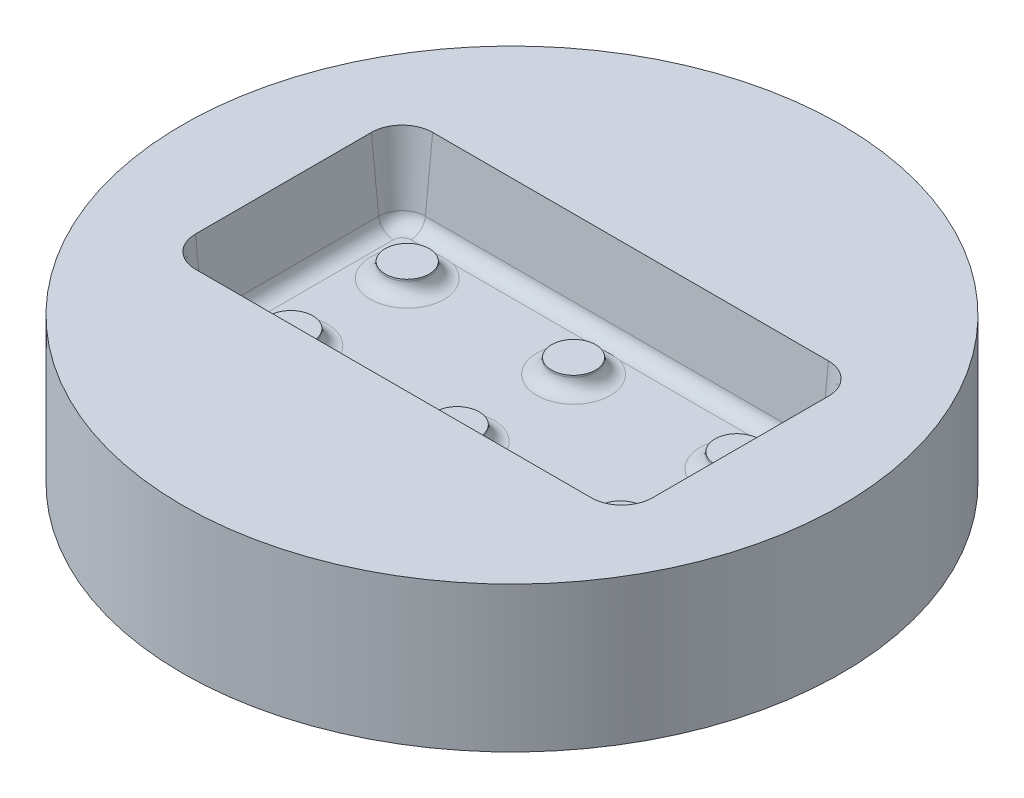
ISO-10303-21;
HEADER;
FILE_DESCRIPTION(('STEP AP214'),'2;1');
FILE_NAME('part.step','',(''),(''),'','','');
FILE_SCHEMA(('AUTOMOTIVE_DESIGN { 1 0 10303 214 1 1 1 1 }'));
ENDSEC;
DATA;
#1=APPLICATION_CONTEXT('core data for automotive mechanical design processes');
#2=APPLICATION_PROTOCOL_DEFINITION('international standard','automotive_design',2000,#1);
#3=PRODUCT_CONTEXT('',#1,'mechanical');
#4=PRODUCT('Part','Part','',(#3));
#5=PRODUCT_RELATED_PRODUCT_CATEGORY('part','',(#4));
#6=PRODUCT_DEFINITION_FORMATION('','',#4);
#7=PRODUCT_DEFINITION_CONTEXT('part definition',#1,'design');
#8=PRODUCT_DEFINITION('design','',#6,#7);
#9=PRODUCT_DEFINITION_SHAPE('','',#8);
#10=(LENGTH_UNIT() NAMED_UNIT(*) SI_UNIT(.MILLI.,.METRE.));
#11=(NAMED_UNIT(*) PLANE_ANGLE_UNIT() SI_UNIT($,.RADIAN.));
#12=(NAMED_UNIT(*) SI_UNIT($,.STERADIAN.) SOLID_ANGLE_UNIT());
#13=UNCERTAINTY_MEASURE_WITH_UNIT(LENGTH_MEASURE(1.E-05),#10,'distance_accuracy_value','');
#14=(GEOMETRIC_REPRESENTATION_CONTEXT(3) GLOBAL_UNCERTAINTY_ASSIGNED_CONTEXT((#13)) GLOBAL_UNIT_ASSIGNED_CONTEXT((#10,
#11,#12)) REPRESENTATION_CONTEXT('',''));
#15=CARTESIAN_POINT('',(0.,0.,0.));
#16=DIRECTION('',(0.,0.,1.));
#17=DIRECTION('',(1.,0.,0.));
#18=AXIS2_PLACEMENT_3D('',#15,#16,#17);
#19=CARTESIAN_POINT('',(0.,-21.9479999999999,0.));
#20=DIRECTION('',(0.,1.,0.));
#21=DIRECTION('',(0.,0.,1.));
#22=AXIS2_PLACEMENT_3D('',#19,#20,#21);
#23=CYLINDRICAL_SURFACE('',#22,114.217109759445);
#24=CARTESIAN_POINT('',(0.,28.448,0.));
#25=DIRECTION('',(0.,-1.,0.));
#26=DIRECTION('',(0.,0.,-1.));
#27=AXIS2_PLACEMENT_3D('',#24,#25,#26);
#28=CIRCLE('',#27,114.217109759445);
#29=CARTESIAN_POINT('',(0.,28.448,-114.217109759445));
#30=VERTEX_POINT('',#29);
#31=EDGE_CURVE('E44',#30,#30,#28,.F.);
#32=ORIENTED_EDGE('',*,*,#31,.F.);
#33=EDGE_LOOP('',(#32));
#34=FACE_BOUND('',#33,.T.);
#35=CARTESIAN_POINT('',(0.,-21.9479999999999,0.));
#36=DIRECTION('',(0.,1.,0.));
#37=DIRECTION('',(0.,0.,1.));
#38=AXIS2_PLACEMENT_3D('',#35,#36,#37);
#39=CIRCLE('',#38,114.217109759445);
#40=CARTESIAN_POINT('',(0.,-21.9479999999999,114.217109759445));
#41=VERTEX_POINT('',#40);
#42=EDGE_CURVE('E197',#41,#41,#39,.T.);
#43=ORIENTED_EDGE('',*,*,#42,.T.);
#44=EDGE_LOOP('',(#43));
#45=FACE_BOUND('',#44,.T.);
#46=ADVANCED_FACE('F41',(#34,#45),#23,.T.);
#47=CARTESIAN_POINT('',(0.,-21.9479999999999,0.));
#48=DIRECTION('',(0.,1.,0.));
#49=DIRECTION('',(0.,0.,1.));
#50=AXIS2_PLACEMENT_3D('',#47,#48,#49);
#51=PLANE('',#50);
#52=ORIENTED_EDGE('',*,*,#42,.F.);
#53=EDGE_LOOP('',(#52));
#54=FACE_BOUND('',#53,.T.);
#55=ADVANCED_FACE('F400',(#54),#51,.F.);
#56=CARTESIAN_POINT('',(56.6116733544156,0.,-21.3549155204973));
#57=DIRECTION('',(0.,-1.,0.));
#58=DIRECTION('',(0.,0.,1.));
#59=AXIS2_PLACEMENT_3D('',#56,#57,#58);
#60=CONICAL_SURFACE('',#59,8.16632827016466,0.10471975511966);
#61=CARTESIAN_POINT('',(56.6116733544156,4.54899540660032,-21.3549155204973));
#62=DIRECTION('',(0.,-1.,0.));
#63=DIRECTION('',(0.,0.,-1.));
#64=AXIS2_PLACEMENT_3D('',#61,#62,#63);
#65=CIRCLE('',#64,7.68820958672686);
#66=CARTESIAN_POINT('',(56.6116733544156,4.54899540660032,-29.0431251072241));
#67=VERTEX_POINT('',#66);
#68=EDGE_CURVE('E202',#67,#67,#65,.T.);
#69=ORIENTED_EDGE('',*,*,#68,.F.);
#70=EDGE_LOOP('',(#69));
#71=FACE_BOUND('',#70,.T.);
#72=CARTESIAN_POINT('',(56.6116733544156,5.08,-21.3549155204973));
#73=DIRECTION('',(0.,1.,0.));
#74=DIRECTION('',(0.,0.,1.));
#75=AXIS2_PLACEMENT_3D('',#72,#73,#74);
#76=CIRCLE('',#75,7.63239875501502);
#77=CARTESIAN_POINT('',(56.6116733544156,5.08,-13.7225167654822));
#78=VERTEX_POINT('',#77);
#79=EDGE_CURVE('E206',#78,#78,#76,.T.);
#80=ORIENTED_EDGE('',*,*,#79,.F.);
#81=EDGE_LOOP('',(#80));
#82=FACE_BOUND('',#81,.T.);
#83=ADVANCED_FACE('F402',(#71,#82),#60,.T.);
#84=CARTESIAN_POINT('',(56.6116733544156,5.08,-21.3549155204973));
#85=DIRECTION('',(0.,-1.,0.));
#86=DIRECTION('',(0.,0.,-1.));
#87=AXIS2_PLACEMENT_3D('',#84,#85,#86);
#88=TOROIDAL_SURFACE('',#87,12.7403808151977,5.08);
#89=ORIENTED_EDGE('',*,*,#68,.T.);
#90=EDGE_LOOP('',(#89));
#91=FACE_BOUND('',#90,.T.);
#92=CARTESIAN_POINT('',(56.6116733544156,0.,-21.3549155204973));
#93=DIRECTION('',(0.,-1.,0.));
#94=DIRECTION('',(0.,0.,-1.));
#95=AXIS2_PLACEMENT_3D('',#92,#93,#94);
#96=CIRCLE('',#95,12.7403808151977);
#97=CARTESIAN_POINT('',(52.845603125865,0.,-33.525947454967));
#98=VERTEX_POINT('',#97);
#99=CARTESIAN_POINT('',(60.3777435829662,0.,-33.525947454967));
#100=VERTEX_POINT('',#99);
#101=EDGE_CURVE('E212',#98,#100,#96,.F.);
#102=ORIENTED_EDGE('',*,*,#101,.T.);
#103=CARTESIAN_POINT('',(60.3777435829662,0.,-33.525947454967));
#104=CARTESIAN_POINT('',(60.3691022754913,7.0221097237528E-09,-33.527253837442));
#105=CARTESIAN_POINT('',(60.3604602795215,5.10568351017943E-07,-33.5285558251084));
#106=CARTESIAN_POINT('',(60.042574509333,3.69626226219725E-05,-33.5762824023694));
#107=CARTESIAN_POINT('',(59.7324565088365,0.00069657338444418,-33.6170815987803));
#108=CARTESIAN_POINT('',(59.1108963569137,0.00243856469882936,-33.6871943275211));
#109=CARTESIAN_POINT('',(58.7994540271289,0.00352100410377502,-33.7165062598314));
#110=CARTESIAN_POINT('',(58.1755037678462,0.00550228255029649,-33.7634911686048));
#111=CARTESIAN_POINT('',(57.8629953224937,0.00640101406231198,-33.7811573418499));
#112=CARTESIAN_POINT('',(57.2375490222082,0.00764116173391657,-33.8047224272097));
#113=CARTESIAN_POINT('',(56.9246111882643,0.00798260422675366,-33.8106218953324));
#114=CARTESIAN_POINT('',(56.2987355203926,0.00798260422664008,-33.8106218953277));
#115=CARTESIAN_POINT('',(55.9857976864647,0.00764116173372302,-33.8047224272009));
#116=CARTESIAN_POINT('',(55.3603513862067,0.00640101406193249,-33.7811573418478));
#117=CARTESIAN_POINT('',(55.0478429408655,0.00550228254980694,-33.7634911686133));
#118=CARTESIAN_POINT('',(54.4238926816168,0.00352100410361389,-33.7165062598074));
#119=CARTESIAN_POINT('',(54.1124503518545,0.00243856469910808,-33.6871943274541));
#120=CARTESIAN_POINT('',(53.4908901999503,0.00069657338386361,-33.6170815988352));
#121=CARTESIAN_POINT('',(53.18077219945,3.69626207363039E-05,-33.5762824025893));
#122=CARTESIAN_POINT('',(52.8628864293115,5.10568246455193E-07,-33.5285558251212));
#123=CARTESIAN_POINT('',(52.8542444333409,7.02205596172312E-09,-33.5272538374486));
#124=CARTESIAN_POINT('',(52.845603125865,0.,-33.525947454967));
#125=B_SPLINE_CURVE_WITH_KNOTS('',3,(#103,#104,#105,#106,#107,#108,#109,#110,#111,#112,#113,
#114,#115,#116,#117,#118,#119,#120,#121,#122,#123,#124),.UNSPECIFIED.,.F.,.F.,(4,2,2,2,2,2,2,2,
2,2,4),(0.,0.0262185642852851,0.964343135646278,1.90259832859866,2.84140114677195,
3.7801596029672,4.71891805911625,5.65772087725022,6.59597607015474,7.53410064145413,
7.560319205745),.UNSPECIFIED.);
#126=EDGE_CURVE('E956',#100,#98,#125,.T.);
#127=ORIENTED_EDGE('',*,*,#126,.T.);
#128=EDGE_LOOP('',(#102,#127));
#129=FACE_BOUND('',#128,.T.);
#130=ADVANCED_FACE('F408',(#91,#129),#88,.F.);
#131=CARTESIAN_POINT('',(0.,0.,-21.3549155204973));
#132=DIRECTION('',(0.,-1.,0.));
#133=DIRECTION('',(0.,0.,1.));
#134=AXIS2_PLACEMENT_3D('',#131,#132,#133);
#135=CONICAL_SURFACE('',#134,8.16632827016466,0.10471975511966);
#136=CARTESIAN_POINT('',(0.,4.54899540660032,-21.3549155204973));
#137=DIRECTION('',(0.,-1.,0.));
#138=DIRECTION('',(0.,0.,-1.));
#139=AXIS2_PLACEMENT_3D('',#136,#137,#138);
#140=CIRCLE('',#139,7.68820958672685);
#141=CARTESIAN_POINT('',(0.,4.54899540660032,-29.0431251072241));
#142=VERTEX_POINT('',#141);
#143=EDGE_CURVE('E908',#142,#142,#140,.T.);
#144=ORIENTED_EDGE('',*,*,#143,.F.);
#145=EDGE_LOOP('',(#144));
#146=FACE_BOUND('',#145,.T.);
#147=CARTESIAN_POINT('',(0.,5.08,-21.3549155204973));
#148=DIRECTION('',(0.,1.,0.));
#149=DIRECTION('',(0.,0.,1.));
#150=AXIS2_PLACEMENT_3D('',#147,#148,#149);
#151=CIRCLE('',#150,7.63239875501502);
#152=CARTESIAN_POINT('',(0.,5.08,-13.7225167654822));
#153=VERTEX_POINT('',#152);
#154=EDGE_CURVE('E215',#153,#153,#151,.T.);
#155=ORIENTED_EDGE('',*,*,#154,.F.);
#156=EDGE_LOOP('',(#155));
#157=FACE_BOUND('',#156,.T.);
#158=ADVANCED_FACE('F354',(#146,#157),#135,.T.);
#159=CARTESIAN_POINT('',(0.,5.08,-21.3549155204973));
#160=DIRECTION('',(0.,-1.,0.));
#161=DIRECTION('',(0.,0.,-1.));
#162=AXIS2_PLACEMENT_3D('',#159,#160,#161);
#163=TOROIDAL_SURFACE('',#162,12.7403808151977,5.08);
#164=ORIENTED_EDGE('',*,*,#143,.T.);
#165=EDGE_LOOP('',(#164));
#166=FACE_BOUND('',#165,.T.);
#167=CARTESIAN_POINT('',(0.,0.,-21.3549155204973));
#168=DIRECTION('',(0.,-1.,0.));
#169=DIRECTION('',(0.,0.,-1.));
#170=AXIS2_PLACEMENT_3D('',#167,#168,#169);
#171=CIRCLE('',#170,12.7403808151977);
#172=CARTESIAN_POINT('',(-3.76607022855059,0.,-33.525947454967));
#173=VERTEX_POINT('',#172);
#174=CARTESIAN_POINT('',(3.76607022855059,0.,-33.525947454967));
#175=VERTEX_POINT('',#174);
#176=EDGE_CURVE('E367',#173,#175,#171,.F.);
#177=ORIENTED_EDGE('',*,*,#176,.T.);
#178=CARTESIAN_POINT('',(3.76607022855059,0.,-33.525947454967));
#179=CARTESIAN_POINT('',(3.75742892107565,7.02210952792845E-09,-33.527253837442));
#180=CARTESIAN_POINT('',(3.74878692510592,5.10568350820868E-07,-33.5285558251084));
#181=CARTESIAN_POINT('',(3.43090115491744,3.69626226217036E-05,-33.5762824023694));
#182=CARTESIAN_POINT('',(3.12078315442102,0.000696573384442937,-33.6170815987803));
#183=CARTESIAN_POINT('',(2.49922300249838,0.00243856469882717,-33.6871943275211));
#184=CARTESIAN_POINT('',(2.18778067271368,0.00352100410377285,-33.7165062598313));
#185=CARTESIAN_POINT('',(1.56383041343132,0.00550228255029443,-33.7634911686048));
#186=CARTESIAN_POINT('',(1.25132196807897,0.00640101406231007,-33.7811573418499));
#187=CARTESIAN_POINT('',(0.625875667793867,0.00764116173391521,-33.8047224272096));
#188=CARTESIAN_POINT('',(0.312937833850147,0.00798260422675264,-33.8106218953323));
#189=CARTESIAN_POINT('',(-0.312937834021525,0.00798260422664139,-33.8106218953277));
#190=CARTESIAN_POINT('',(-0.625875667949476,0.00764116173372574,-33.804722427201));
#191=CARTESIAN_POINT('',(-1.25132196820761,0.0064010140619356,-33.7811573418478));
#192=CARTESIAN_POINT('',(-1.56383041354875,0.00550228254980916,-33.7634911686131));
#193=CARTESIAN_POINT('',(-2.18778067279778,0.00352100410361825,-33.7165062598077));
#194=CARTESIAN_POINT('',(-2.49922300256037,0.00243856469911538,-33.6871943274553));
#195=CARTESIAN_POINT('',(-3.12078315446465,0.000696573383861434,-33.6170815988343));
#196=CARTESIAN_POINT('',(-3.43090115496486,3.69626207218398E-05,-33.5762824025855));
#197=CARTESIAN_POINT('',(-3.74878692510411,5.1056824627784E-07,-33.528555825121));
#198=CARTESIAN_POINT('',(-3.75742892107476,7.02205619320555E-09,-33.5272538374485));
#199=CARTESIAN_POINT('',(-3.76607022855059,0.,-33.525947454967));
#200=B_SPLINE_CURVE_WITH_KNOTS('',3,(#178,#179,#180,#181,#182,#183,#184,#185,#186,#187,#188,
#189,#190,#191,#192,#193,#194,#195,#196,#197,#198,#199),.UNSPECIFIED.,.F.,.F.,(4,2,2,2,2,2,2,2,
2,2,4),(0.,0.0262185642852881,0.964343135646034,1.90259832859816,2.84140114677082,
3.78015960296557,4.7189180591149,5.65772087724894,6.59597607015401,7.5341006414542,
7.56031920574499),.UNSPECIFIED.);
#201=EDGE_CURVE('E358',#175,#173,#200,.T.);
#202=ORIENTED_EDGE('',*,*,#201,.T.);
#203=EDGE_LOOP('',(#177,#202));
#204=FACE_BOUND('',#203,.T.);
#205=ADVANCED_FACE('F349',(#166,#204),#163,.F.);
#206=CARTESIAN_POINT('',(0.,0.,18.9850819011923));
#207=DIRECTION('',(0.,-1.,0.));
#208=DIRECTION('',(0.,0.,1.));
#209=AXIS2_PLACEMENT_3D('',#206,#207,#208);
#210=CONICAL_SURFACE('',#209,8.16632827016466,0.10471975511966);
#211=CARTESIAN_POINT('',(0.,4.54899540660032,18.9850819011923));
#212=DIRECTION('',(0.,-1.,0.));
#213=DIRECTION('',(0.,0.,-1.));
#214=AXIS2_PLACEMENT_3D('',#211,#212,#213);
#215=CIRCLE('',#214,7.68820958672685);
#216=CARTESIAN_POINT('',(0.,4.54899540660032,11.2968723144655));
#217=VERTEX_POINT('',#216);
#218=EDGE_CURVE('E366',#217,#217,#215,.T.);
#219=ORIENTED_EDGE('',*,*,#218,.F.);
#220=EDGE_LOOP('',(#219));
#221=FACE_BOUND('',#220,.T.);
#222=CARTESIAN_POINT('',(0.,5.08,18.9850819011923));
#223=DIRECTION('',(0.,1.,0.));
#224=DIRECTION('',(0.,0.,1.));
#225=AXIS2_PLACEMENT_3D('',#222,#223,#224);
#226=CIRCLE('',#225,7.63239875501502);
#227=CARTESIAN_POINT('',(0.,5.08,26.6174806562073));
#228=VERTEX_POINT('',#227);
#229=EDGE_CURVE('E912',#228,#228,#226,.T.);
#230=ORIENTED_EDGE('',*,*,#229,.F.);
#231=EDGE_LOOP('',(#230));
#232=FACE_BOUND('',#231,.T.);
#233=ADVANCED_FACE('F345',(#221,#232),#210,.T.);
#234=CARTESIAN_POINT('',(0.,5.08,18.9850819011923));
#235=DIRECTION('',(0.,-1.,0.));
#236=DIRECTION('',(0.,0.,-1.));
#237=AXIS2_PLACEMENT_3D('',#234,#235,#236);
#238=TOROIDAL_SURFACE('',#237,12.7403808151977,5.08);
#239=ORIENTED_EDGE('',*,*,#218,.T.);
#240=EDGE_LOOP('',(#239));
#241=FACE_BOUND('',#240,.T.);
#242=CARTESIAN_POINT('',(0.,0.,18.9850819011923));
#243=DIRECTION('',(0.,-1.,0.));
#244=DIRECTION('',(0.,0.,-1.));
#245=AXIS2_PLACEMENT_3D('',#242,#243,#244);
#246=CIRCLE('',#245,12.7403808151977);
#247=CARTESIAN_POINT('',(0.,0.,6.24470108599464));
#248=VERTEX_POINT('',#247);
#249=EDGE_CURVE('E917',#248,#248,#246,.F.);
#250=ORIENTED_EDGE('',*,*,#249,.T.);
#251=EDGE_LOOP('',(#250));
#252=FACE_BOUND('',#251,.T.);
#253=ADVANCED_FACE('F341',(#241,#252),#238,.F.);
#254=CARTESIAN_POINT('',(56.6116733544156,0.,18.9850819011923));
#255=DIRECTION('',(0.,-1.,0.));
#256=DIRECTION('',(0.,0.,1.));
#257=AXIS2_PLACEMENT_3D('',#254,#255,#256);
#258=CONICAL_SURFACE('',#257,8.16632827016466,0.10471975511966);
#259=CARTESIAN_POINT('',(56.6116733544156,4.54899540660032,18.9850819011923));
#260=DIRECTION('',(0.,-1.,0.));
#261=DIRECTION('',(0.,0.,-1.));
#262=AXIS2_PLACEMENT_3D('',#259,#260,#261);
#263=CIRCLE('',#262,7.68820958672686);
#264=CARTESIAN_POINT('',(56.6116733544156,4.54899540660032,11.2968723144655));
#265=VERTEX_POINT('',#264);
#266=EDGE_CURVE('E928',#265,#265,#263,.T.);
#267=ORIENTED_EDGE('',*,*,#266,.F.);
#268=EDGE_LOOP('',(#267));
#269=FACE_BOUND('',#268,.T.);
#270=CARTESIAN_POINT('',(56.6116733544156,5.08,18.9850819011923));
#271=DIRECTION('',(0.,1.,0.));
#272=DIRECTION('',(0.,0.,1.));
#273=AXIS2_PLACEMENT_3D('',#270,#271,#272);
#274=CIRCLE('',#273,7.63239875501502);
#275=CARTESIAN_POINT('',(56.6116733544156,5.08,26.6174806562073));
#276=VERTEX_POINT('',#275);
#277=EDGE_CURVE('E922',#276,#276,#274,.T.);
#278=ORIENTED_EDGE('',*,*,#277,.F.);
#279=EDGE_LOOP('',(#278));
#280=FACE_BOUND('',#279,.T.);
#281=ADVANCED_FACE('F337',(#269,#280),#258,.T.);
#282=CARTESIAN_POINT('',(56.6116733544156,5.08,18.9850819011923));
#283=DIRECTION('',(0.,-1.,0.));
#284=DIRECTION('',(0.,0.,-1.));
#285=AXIS2_PLACEMENT_3D('',#282,#283,#284);
#286=TOROIDAL_SURFACE('',#285,12.7403808151977,5.08);
#287=ORIENTED_EDGE('',*,*,#266,.T.);
#288=EDGE_LOOP('',(#287));
#289=FACE_BOUND('',#288,.T.);
#290=CARTESIAN_POINT('',(56.6116733544156,0.,18.9850819011923));
#291=DIRECTION('',(0.,-1.,0.));
#292=DIRECTION('',(0.,0.,-1.));
#293=AXIS2_PLACEMENT_3D('',#290,#291,#292);
#294=CIRCLE('',#293,12.7403808151977);
#295=CARTESIAN_POINT('',(56.6116733544156,0.,6.24470108599464));
#296=VERTEX_POINT('',#295);
#297=EDGE_CURVE('E927',#296,#296,#294,.F.);
#298=ORIENTED_EDGE('',*,*,#297,.T.);
#299=EDGE_LOOP('',(#298));
#300=FACE_BOUND('',#299,.T.);
#301=ADVANCED_FACE('F333',(#289,#300),#286,.F.);
#302=CARTESIAN_POINT('',(-57.6575438319214,0.,18.9850819011923));
#303=DIRECTION('',(0.,-1.,0.));
#304=DIRECTION('',(0.,0.,1.));
#305=AXIS2_PLACEMENT_3D('',#302,#303,#304);
#306=CONICAL_SURFACE('',#305,8.16632827016466,0.10471975511966);
#307=CARTESIAN_POINT('',(-57.6575438319214,4.54899540660032,18.9850819011923));
#308=DIRECTION('',(0.,-1.,0.));
#309=DIRECTION('',(0.,0.,-1.));
#310=AXIS2_PLACEMENT_3D('',#307,#308,#309);
#311=CIRCLE('',#310,7.68820958672686);
#312=CARTESIAN_POINT('',(-57.6575438319214,4.54899540660032,11.2968723144655));
#313=VERTEX_POINT('',#312);
#314=EDGE_CURVE('E937',#313,#313,#311,.T.);
#315=ORIENTED_EDGE('',*,*,#314,.F.);
#316=EDGE_LOOP('',(#315));
#317=FACE_BOUND('',#316,.T.);
#318=CARTESIAN_POINT('',(-57.6575438319214,5.08,18.9850819011923));
#319=DIRECTION('',(0.,1.,0.));
#320=DIRECTION('',(0.,0.,1.));
#321=AXIS2_PLACEMENT_3D('',#318,#319,#320);
#322=CIRCLE('',#321,7.63239875501502);
#323=CARTESIAN_POINT('',(-57.6575438319214,5.08,26.6174806562073));
#324=VERTEX_POINT('',#323);
#325=EDGE_CURVE('E933',#324,#324,#322,.T.);
#326=ORIENTED_EDGE('',*,*,#325,.F.);
#327=EDGE_LOOP('',(#326));
#328=FACE_BOUND('',#327,.T.);
#329=ADVANCED_FACE('F329',(#317,#328),#306,.T.);
#330=CARTESIAN_POINT('',(-57.6575438319214,5.08,18.9850819011923));
#331=DIRECTION('',(0.,-1.,0.));
#332=DIRECTION('',(0.,0.,-1.));
#333=AXIS2_PLACEMENT_3D('',#330,#331,#332);
#334=TOROIDAL_SURFACE('',#333,12.7403808151977,5.08);
#335=ORIENTED_EDGE('',*,*,#314,.T.);
#336=EDGE_LOOP('',(#335));
#337=FACE_BOUND('',#336,.T.);
#338=CARTESIAN_POINT('',(-57.6575438319214,0.,18.9850819011923));
#339=DIRECTION('',(0.,-1.,0.));
#340=DIRECTION('',(0.,0.,-1.));
#341=AXIS2_PLACEMENT_3D('',#338,#339,#340);
#342=CIRCLE('',#341,12.7403808151977);
#343=CARTESIAN_POINT('',(-57.6575438319214,0.,6.24470108599464));
#344=VERTEX_POINT('',#343);
#345=EDGE_CURVE('E266',#344,#344,#342,.F.);
#346=ORIENTED_EDGE('',*,*,#345,.T.);
#347=EDGE_LOOP('',(#346));
#348=FACE_BOUND('',#347,.T.);
#349=ADVANCED_FACE('F325',(#337,#348),#334,.F.);
#350=CARTESIAN_POINT('',(68.58,0.,-30.48));
#351=DIRECTION('',(0.,-1.,0.));
#352=DIRECTION('',(0.,0.,-1.));
#353=AXIS2_PLACEMENT_3D('',#350,#351,#352);
#354=PLANE('',#353);
#355=ORIENTED_EDGE('',*,*,#345,.F.);
#356=EDGE_LOOP('',(#355));
#357=FACE_BOUND('',#356,.T.);
#358=ORIENTED_EDGE('',*,*,#297,.F.);
#359=EDGE_LOOP('',(#358));
#360=FACE_BOUND('',#359,.T.);
#361=ORIENTED_EDGE('',*,*,#249,.F.);
#362=EDGE_LOOP('',(#361));
#363=FACE_BOUND('',#362,.T.);
#364=DIRECTION('',(0.,0.,1.));
#365=VECTOR('',#364,1.);
#366=CARTESIAN_POINT('',(71.625947454967,0.,30.4799999999999));
#367=LINE('',#366,#365);
#368=CARTESIAN_POINT('',(71.625947454967,0.,-30.48));
#369=VERTEX_POINT('',#368);
#370=CARTESIAN_POINT('',(71.625947454967,0.,30.48));
#371=VERTEX_POINT('',#370);
#372=EDGE_CURVE('E255',#369,#371,#367,.T.);
#373=ORIENTED_EDGE('',*,*,#372,.F.);
#374=CARTESIAN_POINT('',(68.58,0.,-30.48));
#375=DIRECTION('',(0.,-1.,0.));
#376=DIRECTION('',(0.,0.,-1.));
#377=AXIS2_PLACEMENT_3D('',#374,#375,#376);
#378=CIRCLE('',#377,3.04594745496697);
#379=CARTESIAN_POINT('',(68.5799999999999,0.,-33.525947454967));
#380=VERTEX_POINT('',#379);
#381=EDGE_CURVE('E968',#380,#369,#378,.T.);
#382=ORIENTED_EDGE('',*,*,#381,.F.);
#383=DIRECTION('',(1.,0.,0.));
#384=VECTOR('',#383,1.);
#385=CARTESIAN_POINT('',(68.5799999999999,0.,-33.525947454967));
#386=LINE('',#385,#384);
#387=EDGE_CURVE('E965',#100,#380,#386,.T.);
#388=ORIENTED_EDGE('',*,*,#387,.F.);
#389=ORIENTED_EDGE('',*,*,#101,.F.);
#390=DIRECTION('',(1.,0.,0.));
#391=VECTOR('',#390,1.);
#392=CARTESIAN_POINT('',(68.5799999999999,0.,-33.525947454967));
#393=LINE('',#392,#391);
#394=EDGE_CURVE('E368',#175,#98,#393,.T.);
#395=ORIENTED_EDGE('',*,*,#394,.F.);
#396=ORIENTED_EDGE('',*,*,#176,.F.);
#397=DIRECTION('',(1.,0.,0.));
#398=VECTOR('',#397,1.);
#399=CARTESIAN_POINT('',(68.5799999999999,0.,-33.525947454967));
#400=LINE('',#399,#398);
#401=CARTESIAN_POINT('',(-53.8914736033708,0.,-33.525947454967));
#402=VERTEX_POINT('',#401);
#403=EDGE_CURVE('E370',#402,#173,#400,.T.);
#404=ORIENTED_EDGE('',*,*,#403,.F.);
#405=CARTESIAN_POINT('',(-57.6575438319214,0.,-21.3549155204973));
#406=DIRECTION('',(0.,-1.,0.));
#407=DIRECTION('',(0.,0.,-1.));
#408=AXIS2_PLACEMENT_3D('',#405,#406,#407);
#409=CIRCLE('',#408,12.7403808151977);
#410=CARTESIAN_POINT('',(-61.423614060472,0.,-33.525947454967));
#411=VERTEX_POINT('',#410);
#412=EDGE_CURVE('E976',#411,#402,#409,.F.);
#413=ORIENTED_EDGE('',*,*,#412,.F.);
#414=DIRECTION('',(1.,0.,0.));
#415=VECTOR('',#414,1.);
#416=CARTESIAN_POINT('',(68.5799999999999,0.,-33.525947454967));
#417=LINE('',#416,#415);
#418=CARTESIAN_POINT('',(-68.58,0.,-33.525947454967));
#419=VERTEX_POINT('',#418);
#420=EDGE_CURVE('E297',#419,#411,#417,.T.);
#421=ORIENTED_EDGE('',*,*,#420,.F.);
#422=CARTESIAN_POINT('',(-68.58,0.,-30.48));
#423=DIRECTION('',(0.,-1.,0.));
#424=DIRECTION('',(0.,0.,-1.));
#425=AXIS2_PLACEMENT_3D('',#422,#423,#424);
#426=CIRCLE('',#425,3.04594745496697);
#427=CARTESIAN_POINT('',(-71.625947454967,0.,-30.48));
#428=VERTEX_POINT('',#427);
#429=EDGE_CURVE('E289',#428,#419,#426,.T.);
#430=ORIENTED_EDGE('',*,*,#429,.F.);
#431=DIRECTION('',(0.,0.,-1.));
#432=VECTOR('',#431,1.);
#433=CARTESIAN_POINT('',(-71.625947454967,0.,-30.48));
#434=LINE('',#433,#432);
#435=CARTESIAN_POINT('',(-71.625947454967,0.,30.4799999999999));
#436=VERTEX_POINT('',#435);
#437=EDGE_CURVE('E283',#436,#428,#434,.T.);
#438=ORIENTED_EDGE('',*,*,#437,.F.);
#439=CARTESIAN_POINT('',(-68.58,0.,30.48));
#440=DIRECTION('',(0.,-1.,0.));
#441=DIRECTION('',(0.,0.,-1.));
#442=AXIS2_PLACEMENT_3D('',#439,#440,#441);
#443=CIRCLE('',#442,3.04594745496697);
#444=CARTESIAN_POINT('',(-68.58,0.,33.525947454967));
#445=VERTEX_POINT('',#444);
#446=EDGE_CURVE('E277',#445,#436,#443,.T.);
#447=ORIENTED_EDGE('',*,*,#446,.F.);
#448=DIRECTION('',(-1.,0.,0.));
#449=VECTOR('',#448,1.);
#450=CARTESIAN_POINT('',(-68.58,0.,33.525947454967));
#451=LINE('',#450,#449);
#452=CARTESIAN_POINT('',(68.5799999999999,0.,33.525947454967));
#453=VERTEX_POINT('',#452);
#454=EDGE_CURVE('E270',#453,#445,#451,.T.);
#455=ORIENTED_EDGE('',*,*,#454,.F.);
#456=CARTESIAN_POINT('',(68.58,0.,30.48));
#457=DIRECTION('',(0.,-1.,0.));
#458=DIRECTION('',(0.,0.,-1.));
#459=AXIS2_PLACEMENT_3D('',#456,#457,#458);
#460=CIRCLE('',#459,3.04594745496697);
#461=EDGE_CURVE('E265',#371,#453,#460,.T.);
#462=ORIENTED_EDGE('',*,*,#461,.F.);
#463=EDGE_LOOP('',(#373,#382,#388,#389,#395,#396,#404,#413,#421,#430,#438,#447,#455,#462));
#464=FACE_BOUND('',#463,.T.);
#465=ADVANCED_FACE('F321',(#357,#360,#363,#464),#354,.F.);
#466=CARTESIAN_POINT('',(-57.6575438319214,0.,-21.3549155204973));
#467=DIRECTION('',(0.,-1.,0.));
#468=DIRECTION('',(0.,0.,1.));
#469=AXIS2_PLACEMENT_3D('',#466,#467,#468);
#470=CONICAL_SURFACE('',#469,8.16632827016466,0.10471975511966);
#471=CARTESIAN_POINT('',(-57.6575438319214,4.54899540660032,-21.3549155204973));
#472=DIRECTION('',(0.,-1.,0.));
#473=DIRECTION('',(0.,0.,-1.));
#474=AXIS2_PLACEMENT_3D('',#471,#472,#473);
#475=CIRCLE('',#474,7.68820958672686);
#476=CARTESIAN_POINT('',(-57.6575438319214,4.54899540660032,-29.0431251072241));
#477=VERTEX_POINT('',#476);
#478=EDGE_CURVE('E893',#477,#477,#475,.T.);
#479=ORIENTED_EDGE('',*,*,#478,.F.);
#480=EDGE_LOOP('',(#479));
#481=FACE_BOUND('',#480,.T.);
#482=CARTESIAN_POINT('',(-57.6575438319214,5.08,-21.3549155204973));
#483=DIRECTION('',(0.,1.,0.));
#484=DIRECTION('',(0.,0.,1.));
#485=AXIS2_PLACEMENT_3D('',#482,#483,#484);
#486=CIRCLE('',#485,7.63239875501502);
#487=CARTESIAN_POINT('',(-57.6575438319214,5.08,-13.7225167654822));
#488=VERTEX_POINT('',#487);
#489=EDGE_CURVE('E305',#488,#488,#486,.T.);
#490=ORIENTED_EDGE('',*,*,#489,.F.);
#491=EDGE_LOOP('',(#490));
#492=FACE_BOUND('',#491,.T.);
#493=ADVANCED_FACE('F316',(#481,#492),#470,.T.);
#494=CARTESIAN_POINT('',(-57.6575438319214,5.08,-21.3549155204973));
#495=DIRECTION('',(0.,-1.,0.));
#496=DIRECTION('',(0.,0.,-1.));
#497=AXIS2_PLACEMENT_3D('',#494,#495,#496);
#498=TOROIDAL_SURFACE('',#497,12.7403808151977,5.08);
#499=ORIENTED_EDGE('',*,*,#478,.T.);
#500=EDGE_LOOP('',(#499));
#501=FACE_BOUND('',#500,.T.);
#502=ORIENTED_EDGE('',*,*,#412,.T.);
#503=CARTESIAN_POINT('',(-53.8914736033708,0.,-33.525947454967));
#504=CARTESIAN_POINT('',(-53.9001149108457,7.02210967198882E-09,-33.527253837442));
#505=CARTESIAN_POINT('',(-53.9087569068155,5.10568350965878E-07,-33.5285558251084));
#506=CARTESIAN_POINT('',(-54.2266426770039,3.69626226219103E-05,-33.5762824023694));
#507=CARTESIAN_POINT('',(-54.5367606775003,0.000696573384444134,-33.6170815987803));
#508=CARTESIAN_POINT('',(-55.1583208294229,0.00243856469882813,-33.6871943275211));
#509=CARTESIAN_POINT('',(-55.4697631592076,0.00352100410377258,-33.7165062598313));
#510=CARTESIAN_POINT('',(-56.09371341849,0.00550228255029354,-33.7634911686047));
#511=CARTESIAN_POINT('',(-56.4062218638423,0.00640101406230981,-33.7811573418499));
#512=CARTESIAN_POINT('',(-57.0316681641273,0.00764116173391531,-33.8047224272096));
#513=CARTESIAN_POINT('',(-57.344605998071,0.00798260422675245,-33.8106218953323));
#514=CARTESIAN_POINT('',(-57.9704816659427,0.00798260422664122,-33.8106218953277));
#515=CARTESIAN_POINT('',(-58.2834194998707,0.00764116173372581,-33.804722427201));
#516=CARTESIAN_POINT('',(-58.9088658001288,0.00640101406193685,-33.7811573418478));
#517=CARTESIAN_POINT('',(-59.22137424547,0.00550228254981137,-33.7634911686131));
#518=CARTESIAN_POINT('',(-59.845324504719,0.00352100410361871,-33.7165062598078));
#519=CARTESIAN_POINT('',(-60.1567668344817,0.00243856469911312,-33.6871943274554));
#520=CARTESIAN_POINT('',(-60.778326986386,0.000696573383863584,-33.6170815988341));
#521=CARTESIAN_POINT('',(-61.0884449868862,3.69626207311237E-05,-33.5762824025851));
#522=CARTESIAN_POINT('',(-61.4063307570255,5.1056824651713E-07,-33.528555825121));
#523=CARTESIAN_POINT('',(-61.4149727529962,7.02205617413999E-09,-33.5272538374485));
#524=CARTESIAN_POINT('',(-61.423614060472,0.,-33.525947454967));
#525=B_SPLINE_CURVE_WITH_KNOTS('',3,(#503,#504,#505,#506,#507,#508,#509,#510,#511,#512,#513,
#514,#515,#516,#517,#518,#519,#520,#521,#522,#523,#524),.UNSPECIFIED.,.F.,.F.,(4,2,2,2,2,2,2,2,
2,2,4),(0.,0.0262185642852851,0.964343135645992,1.90259832859807,2.84140114677066,
3.78015960296536,4.71891805911473,5.65772087724877,6.59597607015392,7.53410064145421,
7.56031920574499),.UNSPECIFIED.);
#526=EDGE_CURVE('E294',#402,#411,#525,.T.);
#527=ORIENTED_EDGE('',*,*,#526,.T.);
#528=EDGE_LOOP('',(#502,#527));
#529=FACE_BOUND('',#528,.T.);
#530=ADVANCED_FACE('F310',(#501,#529),#498,.F.);
#531=CARTESIAN_POINT('',(-68.58,5.08,-33.525947454967));
#532=DIRECTION('',(-1.,0.,0.));
#533=DIRECTION('',(0.,0.,1.));
#534=AXIS2_PLACEMENT_3D('',#531,#532,#533);
#535=CYLINDRICAL_SURFACE('',#534,5.08);
#536=ORIENTED_EDGE('',*,*,#526,.F.);
#537=ORIENTED_EDGE('',*,*,#403,.T.);
#538=ORIENTED_EDGE('',*,*,#201,.F.);
#539=ORIENTED_EDGE('',*,*,#394,.T.);
#540=ORIENTED_EDGE('',*,*,#126,.F.);
#541=ORIENTED_EDGE('',*,*,#387,.T.);
#542=CARTESIAN_POINT('',(68.58,5.08,-33.525947454967));
#543=DIRECTION('',(-1.,0.,0.));
#544=DIRECTION('',(0.,-1.,0.));
#545=AXIS2_PLACEMENT_3D('',#542,#543,#544);
#546=CIRCLE('',#545,5.08);
#547=CARTESIAN_POINT('',(68.5799999999999,4.54899540660032,-38.5781186834378));
#548=VERTEX_POINT('',#547);
#549=EDGE_CURVE('E262',#548,#380,#546,.T.);
#550=ORIENTED_EDGE('',*,*,#549,.F.);
#551=DIRECTION('',(-1.,0.,0.));
#552=VECTOR('',#551,1.);
#553=CARTESIAN_POINT('',(-68.58,4.54899540660032,-38.5781186834378));
#554=LINE('',#553,#552);
#555=CARTESIAN_POINT('',(-68.58,4.54899540660032,-38.5781186834378));
#556=VERTEX_POINT('',#555);
#557=EDGE_CURVE('E293',#548,#556,#554,.T.);
#558=ORIENTED_EDGE('',*,*,#557,.T.);
#559=CARTESIAN_POINT('',(-68.58,5.08,-33.525947454967));
#560=DIRECTION('',(1.,0.,0.));
#561=DIRECTION('',(0.,0.,-1.));
#562=AXIS2_PLACEMENT_3D('',#559,#560,#561);
#563=CIRCLE('',#562,5.08);
#564=EDGE_CURVE('E290',#419,#556,#563,.T.);
#565=ORIENTED_EDGE('',*,*,#564,.F.);
#566=ORIENTED_EDGE('',*,*,#420,.T.);
#567=EDGE_LOOP('',(#536,#537,#538,#539,#540,#541,#550,#558,#565,#566));
#568=FACE_BOUND('',#567,.T.);
#569=ADVANCED_FACE('F315',(#568),#535,.F.);
#570=CARTESIAN_POINT('',(-68.58,5.08,-30.48));
#571=DIRECTION('',(0.,-1.,0.));
#572=DIRECTION('',(0.,0.,-1.));
#573=AXIS2_PLACEMENT_3D('',#570,#571,#572);
#574=DEGENERATE_TOROIDAL_SURFACE('',#573,3.04594745496697,5.08,.T.);
#575=CARTESIAN_POINT('',(-71.625947454967,5.08,-30.48));
#576=DIRECTION('',(0.,0.,-1.));
#577=DIRECTION('',(-1.,0.,0.));
#578=AXIS2_PLACEMENT_3D('',#575,#576,#577);
#579=CIRCLE('',#578,5.08);
#580=CARTESIAN_POINT('',(-76.6781186834378,4.54899540660032,-30.48));
#581=VERTEX_POINT('',#580);
#582=EDGE_CURVE('E284',#428,#581,#579,.T.);
#583=ORIENTED_EDGE('',*,*,#582,.F.);
#584=ORIENTED_EDGE('',*,*,#429,.T.);
#585=ORIENTED_EDGE('',*,*,#564,.T.);
#586=CARTESIAN_POINT('',(-68.58,4.54899540660032,-30.48));
#587=DIRECTION('',(0.,1.,0.));
#588=DIRECTION('',(0.,0.,1.));
#589=AXIS2_PLACEMENT_3D('',#586,#587,#588);
#590=CIRCLE('',#589,8.0981186834378);
#591=EDGE_CURVE('E176',#556,#581,#590,.T.);
#592=ORIENTED_EDGE('',*,*,#591,.T.);
#593=EDGE_LOOP('',(#583,#584,#585,#592));
#594=FACE_BOUND('',#593,.T.);
#595=ADVANCED_FACE('F570',(#594),#574,.F.);
#596=CARTESIAN_POINT('',(-71.625947454967,5.08,-30.48));
#597=DIRECTION('',(0.,0.,1.));
#598=DIRECTION('',(1.,0.,0.));
#599=AXIS2_PLACEMENT_3D('',#596,#597,#598);
#600=CYLINDRICAL_SURFACE('',#599,5.08);
#601=CARTESIAN_POINT('',(-71.625947454967,5.08,30.4799999999999));
#602=DIRECTION('',(0.,0.,-1.));
#603=DIRECTION('',(-1.,0.,0.));
#604=AXIS2_PLACEMENT_3D('',#601,#602,#603);
#605=CIRCLE('',#604,5.08);
#606=CARTESIAN_POINT('',(-76.6781186834378,4.54899540660032,30.4799999999999));
#607=VERTEX_POINT('',#606);
#608=EDGE_CURVE('E278',#436,#607,#605,.T.);
#609=ORIENTED_EDGE('',*,*,#608,.F.);
#610=ORIENTED_EDGE('',*,*,#437,.T.);
#611=ORIENTED_EDGE('',*,*,#582,.T.);
#612=DIRECTION('',(0.,0.,1.));
#613=VECTOR('',#612,1.);
#614=CARTESIAN_POINT('',(-76.6781186834378,4.54899540660032,30.4799999999999));
#615=LINE('',#614,#613);
#616=EDGE_CURVE('E274',#581,#607,#615,.T.);
#617=ORIENTED_EDGE('',*,*,#616,.T.);
#618=EDGE_LOOP('',(#609,#610,#611,#617));
#619=FACE_BOUND('',#618,.T.);
#620=ADVANCED_FACE('F584',(#619),#600,.F.);
#621=CARTESIAN_POINT('',(-68.58,5.08,30.48));
#622=DIRECTION('',(0.,-1.,0.));
#623=DIRECTION('',(0.,0.,-1.));
#624=AXIS2_PLACEMENT_3D('',#621,#622,#623);
#625=DEGENERATE_TOROIDAL_SURFACE('',#624,3.04594745496697,5.08,.T.);
#626=CARTESIAN_POINT('',(-68.58,5.08,33.525947454967));
#627=DIRECTION('',(-1.,0.,0.));
#628=DIRECTION('',(0.,0.,1.));
#629=AXIS2_PLACEMENT_3D('',#626,#627,#628);
#630=CIRCLE('',#629,5.08);
#631=CARTESIAN_POINT('',(-68.58,4.54899540660032,38.5781186834378));
#632=VERTEX_POINT('',#631);
#633=EDGE_CURVE('E271',#445,#632,#630,.T.);
#634=ORIENTED_EDGE('',*,*,#633,.F.);
#635=ORIENTED_EDGE('',*,*,#446,.T.);
#636=ORIENTED_EDGE('',*,*,#608,.T.);
#637=CARTESIAN_POINT('',(-68.58,4.54899540660032,30.48));
#638=DIRECTION('',(0.,1.,0.));
#639=DIRECTION('',(0.,0.,1.));
#640=AXIS2_PLACEMENT_3D('',#637,#638,#639);
#641=CIRCLE('',#640,8.0981186834378);
#642=EDGE_CURVE('E268',#607,#632,#641,.T.);
#643=ORIENTED_EDGE('',*,*,#642,.T.);
#644=EDGE_LOOP('',(#634,#635,#636,#643));
#645=FACE_BOUND('',#644,.T.);
#646=ADVANCED_FACE('F597',(#645),#625,.F.);
#647=CARTESIAN_POINT('',(-68.5799999999999,5.08,33.525947454967));
#648=DIRECTION('',(1.,0.,0.));
#649=DIRECTION('',(0.,0.,-1.));
#650=AXIS2_PLACEMENT_3D('',#647,#648,#649);
#651=CYLINDRICAL_SURFACE('',#650,5.08);
#652=ORIENTED_EDGE('',*,*,#633,.T.);
#653=DIRECTION('',(1.,0.,0.));
#654=VECTOR('',#653,1.);
#655=CARTESIAN_POINT('',(68.5799999999999,4.54899540660032,38.5781186834378));
#656=LINE('',#655,#654);
#657=CARTESIAN_POINT('',(68.5799999999999,4.54899540660032,38.5781186834378));
#658=VERTEX_POINT('',#657);
#659=EDGE_CURVE('E257',#632,#658,#656,.T.);
#660=ORIENTED_EDGE('',*,*,#659,.T.);
#661=CARTESIAN_POINT('',(68.5799999999999,5.08,33.525947454967));
#662=DIRECTION('',(1.,0.,0.));
#663=DIRECTION('',(0.,0.,-1.));
#664=AXIS2_PLACEMENT_3D('',#661,#662,#663);
#665=CIRCLE('',#664,5.08);
#666=EDGE_CURVE('E251',#658,#453,#665,.T.);
#667=ORIENTED_EDGE('',*,*,#666,.T.);
#668=ORIENTED_EDGE('',*,*,#454,.T.);
#669=EDGE_LOOP('',(#652,#660,#667,#668));
#670=FACE_BOUND('',#669,.T.);
#671=ADVANCED_FACE('F611',(#670),#651,.F.);
#672=CARTESIAN_POINT('',(68.58,5.08,30.48));
#673=DIRECTION('',(0.,-1.,0.));
#674=DIRECTION('',(0.,0.,-1.));
#675=AXIS2_PLACEMENT_3D('',#672,#673,#674);
#676=DEGENERATE_TOROIDAL_SURFACE('',#675,3.04594745496697,5.08,.T.);
#677=ORIENTED_EDGE('',*,*,#666,.F.);
#678=CARTESIAN_POINT('',(68.58,4.54899540660032,30.48));
#679=DIRECTION('',(0.,1.,0.));
#680=DIRECTION('',(0.,0.,1.));
#681=AXIS2_PLACEMENT_3D('',#678,#679,#680);
#682=CIRCLE('',#681,8.0981186834378);
#683=CARTESIAN_POINT('',(76.6781186834378,4.54899540660032,30.4799999999999));
#684=VERTEX_POINT('',#683);
#685=EDGE_CURVE('E233',#658,#684,#682,.T.);
#686=ORIENTED_EDGE('',*,*,#685,.T.);
#687=CARTESIAN_POINT('',(71.625947454967,5.08,30.48));
#688=DIRECTION('',(0.,0.,-1.));
#689=DIRECTION('',(-1.,0.,0.));
#690=AXIS2_PLACEMENT_3D('',#687,#688,#689);
#691=CIRCLE('',#690,5.08);
#692=EDGE_CURVE('E249',#684,#371,#691,.T.);
#693=ORIENTED_EDGE('',*,*,#692,.T.);
#694=ORIENTED_EDGE('',*,*,#461,.T.);
#695=EDGE_LOOP('',(#677,#686,#693,#694));
#696=FACE_BOUND('',#695,.T.);
#697=ADVANCED_FACE('F247',(#696),#676,.F.);
#698=CARTESIAN_POINT('',(71.625947454967,5.08,-30.48));
#699=DIRECTION('',(0.,0.,-1.));
#700=DIRECTION('',(-1.,0.,0.));
#701=AXIS2_PLACEMENT_3D('',#698,#699,#700);
#702=CYLINDRICAL_SURFACE('',#701,5.08);
#703=ORIENTED_EDGE('',*,*,#692,.F.);
#704=DIRECTION('',(0.,0.,-1.));
#705=VECTOR('',#704,1.);
#706=CARTESIAN_POINT('',(76.6781186834378,4.54899540660032,-30.48));
#707=LINE('',#706,#705);
#708=CARTESIAN_POINT('',(76.6781186834378,4.54899540660032,-30.48));
#709=VERTEX_POINT('',#708);
#710=EDGE_CURVE('E237',#684,#709,#707,.T.);
#711=ORIENTED_EDGE('',*,*,#710,.T.);
#712=CARTESIAN_POINT('',(71.625947454967,5.08,-30.48));
#713=DIRECTION('',(0.,0.,-1.));
#714=DIRECTION('',(-1.,0.,0.));
#715=AXIS2_PLACEMENT_3D('',#712,#713,#714);
#716=CIRCLE('',#715,5.08);
#717=EDGE_CURVE('E243',#709,#369,#716,.T.);
#718=ORIENTED_EDGE('',*,*,#717,.T.);
#719=ORIENTED_EDGE('',*,*,#372,.T.);
#720=EDGE_LOOP('',(#703,#711,#718,#719));
#721=FACE_BOUND('',#720,.T.);
#722=ADVANCED_FACE('F253',(#721),#702,.F.);
#723=CARTESIAN_POINT('',(68.58,5.08,-30.48));
#724=DIRECTION('',(0.,-1.,0.));
#725=DIRECTION('',(0.,0.,-1.));
#726=AXIS2_PLACEMENT_3D('',#723,#724,#725);
#727=DEGENERATE_TOROIDAL_SURFACE('',#726,3.04594745496697,5.08,.T.);
#728=ORIENTED_EDGE('',*,*,#717,.F.);
#729=CARTESIAN_POINT('',(68.58,4.54899540660032,-30.48));
#730=DIRECTION('',(0.,1.,0.));
#731=DIRECTION('',(0.,0.,1.));
#732=AXIS2_PLACEMENT_3D('',#729,#730,#731);
#733=CIRCLE('',#732,8.0981186834378);
#734=EDGE_CURVE('E220',#709,#548,#733,.T.);
#735=ORIENTED_EDGE('',*,*,#734,.T.);
#736=ORIENTED_EDGE('',*,*,#549,.T.);
#737=ORIENTED_EDGE('',*,*,#381,.T.);
#738=EDGE_LOOP('',(#728,#735,#736,#737));
#739=FACE_BOUND('',#738,.T.);
#740=ADVANCED_FACE('F650',(#739),#727,.F.);
#741=CARTESIAN_POINT('',(68.58,0.,-30.48));
#742=DIRECTION('',(0.,1.,0.));
#743=DIRECTION('',(0.,0.,-1.));
#744=AXIS2_PLACEMENT_3D('',#741,#742,#743);
#745=CONICAL_SURFACE('',#744,7.62,0.10471975511966);
#746=DIRECTION('',(0.104528463267654,0.994521895368273,0.));
#747=VECTOR('',#746,1.);
#748=CARTESIAN_POINT('',(76.2,0.,-30.48));
#749=LINE('',#748,#747);
#750=CARTESIAN_POINT('',(79.190005284838,28.448,-30.48));
#751=VERTEX_POINT('',#750);
#752=EDGE_CURVE('E218',#751,#709,#749,.F.);
#753=ORIENTED_EDGE('',*,*,#752,.F.);
#754=CARTESIAN_POINT('',(68.58,28.448,-30.48));
#755=DIRECTION('',(0.,1.,0.));
#756=DIRECTION('',(0.,0.,1.));
#757=AXIS2_PLACEMENT_3D('',#754,#755,#756);
#758=CIRCLE('',#757,10.610005284838);
#759=CARTESIAN_POINT('',(68.58,28.448,-41.090005284838));
#760=VERTEX_POINT('',#759);
#761=EDGE_CURVE('E178',#751,#760,#758,.T.);
#762=ORIENTED_EDGE('',*,*,#761,.T.);
#763=DIRECTION('',(0.,0.994521895368273,-0.104528463267654));
#764=VECTOR('',#763,1.);
#765=CARTESIAN_POINT('',(68.5799999999999,0.,-38.1));
#766=LINE('',#765,#764);
#767=EDGE_CURVE('E165',#760,#548,#766,.F.);
#768=ORIENTED_EDGE('',*,*,#767,.T.);
#769=ORIENTED_EDGE('',*,*,#734,.F.);
#770=EDGE_LOOP('',(#753,#762,#768,#769));
#771=FACE_BOUND('',#770,.T.);
#772=ADVANCED_FACE('F663',(#771),#745,.F.);
#773=CARTESIAN_POINT('',(-68.58,0.,-38.1));
#774=DIRECTION('',(0.,-0.104528463267654,-0.994521895368273));
#775=DIRECTION('',(0.,0.994521895368273,-0.104528463267654));
#776=AXIS2_PLACEMENT_3D('',#773,#774,#775);
#777=PLANE('',#776);
#778=ORIENTED_EDGE('',*,*,#767,.F.);
#779=DIRECTION('',(1.,0.,0.));
#780=VECTOR('',#779,1.);
#781=CARTESIAN_POINT('',(68.58,28.448,-41.090005284838));
#782=LINE('',#781,#780);
#783=CARTESIAN_POINT('',(-68.58,28.448,-41.090005284838));
#784=VERTEX_POINT('',#783);
#785=EDGE_CURVE('E159',#760,#784,#782,.F.);
#786=ORIENTED_EDGE('',*,*,#785,.T.);
#787=DIRECTION('',(0.,0.994521895368273,-0.104528463267654));
#788=VECTOR('',#787,1.);
#789=CARTESIAN_POINT('',(-68.58,0.,-38.1));
#790=LINE('',#789,#788);
#791=EDGE_CURVE('E163',#784,#556,#790,.F.);
#792=ORIENTED_EDGE('',*,*,#791,.T.);
#793=ORIENTED_EDGE('',*,*,#557,.F.);
#794=EDGE_LOOP('',(#778,#786,#792,#793));
#795=FACE_BOUND('',#794,.T.);
#796=ADVANCED_FACE('F161',(#795),#777,.F.);
#797=CARTESIAN_POINT('',(-68.58,0.,-30.48));
#798=DIRECTION('',(0.,1.,0.));
#799=DIRECTION('',(0.,0.,1.));
#800=AXIS2_PLACEMENT_3D('',#797,#798,#799);
#801=CONICAL_SURFACE('',#800,7.62,0.10471975511966);
#802=ORIENTED_EDGE('',*,*,#791,.F.);
#803=CARTESIAN_POINT('',(-68.58,28.448,-30.48));
#804=DIRECTION('',(0.,1.,0.));
#805=DIRECTION('',(0.,0.,1.));
#806=AXIS2_PLACEMENT_3D('',#803,#804,#805);
#807=CIRCLE('',#806,10.610005284838);
#808=CARTESIAN_POINT('',(-79.190005284838,28.448,-30.48));
#809=VERTEX_POINT('',#808);
#810=EDGE_CURVE('E174',#784,#809,#807,.T.);
#811=ORIENTED_EDGE('',*,*,#810,.T.);
#812=DIRECTION('',(-0.104528463267654,0.994521895368273,0.));
#813=VECTOR('',#812,1.);
#814=CARTESIAN_POINT('',(-76.2,0.,-30.48));
#815=LINE('',#814,#813);
#816=EDGE_CURVE('E170',#809,#581,#815,.F.);
#817=ORIENTED_EDGE('',*,*,#816,.T.);
#818=ORIENTED_EDGE('',*,*,#591,.F.);
#819=EDGE_LOOP('',(#802,#811,#817,#818));
#820=FACE_BOUND('',#819,.T.);
#821=ADVANCED_FACE('F173',(#820),#801,.F.);
#822=CARTESIAN_POINT('',(-76.2,0.,-30.48));
#823=DIRECTION('',(-0.994521895368273,-0.104528463267654,0.));
#824=DIRECTION('',(0.104528463267654,-0.994521895368273,0.));
#825=AXIS2_PLACEMENT_3D('',#822,#823,#824);
#826=PLANE('',#825);
#827=ORIENTED_EDGE('',*,*,#816,.F.);
#828=DIRECTION('',(0.,0.,-1.));
#829=VECTOR('',#828,1.);
#830=CARTESIAN_POINT('',(-79.190005284838,28.448,-30.48));
#831=LINE('',#830,#829);
#832=CARTESIAN_POINT('',(-79.190005284838,28.448,30.48));
#833=VERTEX_POINT('',#832);
#834=EDGE_CURVE('E150',#809,#833,#831,.F.);
#835=ORIENTED_EDGE('',*,*,#834,.T.);
#836=DIRECTION('',(-0.104528463267654,0.994521895368273,0.));
#837=VECTOR('',#836,1.);
#838=CARTESIAN_POINT('',(-76.2,0.,30.4799999999999));
#839=LINE('',#838,#837);
#840=EDGE_CURVE('E140',#833,#607,#839,.F.);
#841=ORIENTED_EDGE('',*,*,#840,.T.);
#842=ORIENTED_EDGE('',*,*,#616,.F.);
#843=EDGE_LOOP('',(#827,#835,#841,#842));
#844=FACE_BOUND('',#843,.T.);
#845=ADVANCED_FACE('F702',(#844),#826,.F.);
#846=CARTESIAN_POINT('',(-68.58,0.,30.48));
#847=DIRECTION('',(0.,1.,0.));
#848=DIRECTION('',(0.,0.,1.));
#849=AXIS2_PLACEMENT_3D('',#846,#847,#848);
#850=CONICAL_SURFACE('',#849,7.62,0.10471975511966);
#851=ORIENTED_EDGE('',*,*,#840,.F.);
#852=CARTESIAN_POINT('',(-68.58,28.448,30.48));
#853=DIRECTION('',(0.,1.,0.));
#854=DIRECTION('',(0.,0.,1.));
#855=AXIS2_PLACEMENT_3D('',#852,#853,#854);
#856=CIRCLE('',#855,10.610005284838);
#857=CARTESIAN_POINT('',(-68.58,28.448,41.090005284838));
#858=VERTEX_POINT('',#857);
#859=EDGE_CURVE('E146',#833,#858,#856,.T.);
#860=ORIENTED_EDGE('',*,*,#859,.T.);
#861=DIRECTION('',(0.,0.994521895368273,0.104528463267654));
#862=VECTOR('',#861,1.);
#863=CARTESIAN_POINT('',(-68.58,0.,38.1));
#864=LINE('',#863,#862);
#865=EDGE_CURVE('E132',#858,#632,#864,.F.);
#866=ORIENTED_EDGE('',*,*,#865,.T.);
#867=ORIENTED_EDGE('',*,*,#642,.F.);
#868=EDGE_LOOP('',(#851,#860,#866,#867));
#869=FACE_BOUND('',#868,.T.);
#870=ADVANCED_FACE('F715',(#869),#850,.F.);
#871=CARTESIAN_POINT('',(-68.5799999999999,0.,38.1));
#872=DIRECTION('',(0.,-0.104528463267654,0.994521895368273));
#873=DIRECTION('',(0.,-0.994521895368273,-0.104528463267654));
#874=AXIS2_PLACEMENT_3D('',#871,#872,#873);
#875=PLANE('',#874);
#876=ORIENTED_EDGE('',*,*,#865,.F.);
#877=DIRECTION('',(-1.,0.,0.));
#878=VECTOR('',#877,1.);
#879=CARTESIAN_POINT('',(68.58,28.448,41.090005284838));
#880=LINE('',#879,#878);
#881=CARTESIAN_POINT('',(68.5799999999999,28.448,41.090005284838));
#882=VERTEX_POINT('',#881);
#883=EDGE_CURVE('E226',#858,#882,#880,.F.);
#884=ORIENTED_EDGE('',*,*,#883,.T.);
#885=DIRECTION('',(0.,0.994521895368273,0.104528463267654));
#886=VECTOR('',#885,1.);
#887=CARTESIAN_POINT('',(68.5799999999999,0.,38.1));
#888=LINE('',#887,#886);
#889=EDGE_CURVE('E194',#882,#658,#888,.F.);
#890=ORIENTED_EDGE('',*,*,#889,.T.);
#891=ORIENTED_EDGE('',*,*,#659,.F.);
#892=EDGE_LOOP('',(#876,#884,#890,#891));
#893=FACE_BOUND('',#892,.T.);
#894=ADVANCED_FACE('F728',(#893),#875,.F.);
#895=CARTESIAN_POINT('',(68.58,0.,30.48));
#896=DIRECTION('',(0.,1.,0.));
#897=DIRECTION('',(0.,0.,1.));
#898=AXIS2_PLACEMENT_3D('',#895,#896,#897);
#899=CONICAL_SURFACE('',#898,7.62,0.10471975511966);
#900=ORIENTED_EDGE('',*,*,#889,.F.);
#901=CARTESIAN_POINT('',(68.58,28.448,30.48));
#902=DIRECTION('',(0.,1.,0.));
#903=DIRECTION('',(0.,0.,1.));
#904=AXIS2_PLACEMENT_3D('',#901,#902,#903);
#905=CIRCLE('',#904,10.610005284838);
#906=CARTESIAN_POINT('',(79.190005284838,28.448,30.48));
#907=VERTEX_POINT('',#906);
#908=EDGE_CURVE('E51',#882,#907,#905,.T.);
#909=ORIENTED_EDGE('',*,*,#908,.T.);
#910=DIRECTION('',(0.104528463267654,0.994521895368273,0.));
#911=VECTOR('',#910,1.);
#912=CARTESIAN_POINT('',(76.2,0.,30.4799999999999));
#913=LINE('',#912,#911);
#914=EDGE_CURVE('E196',#907,#684,#913,.F.);
#915=ORIENTED_EDGE('',*,*,#914,.T.);
#916=ORIENTED_EDGE('',*,*,#685,.F.);
#917=EDGE_LOOP('',(#900,#909,#915,#916));
#918=FACE_BOUND('',#917,.T.);
#919=ADVANCED_FACE('F231',(#918),#899,.F.);
#920=CARTESIAN_POINT('',(76.2,0.,-30.48));
#921=DIRECTION('',(0.994521895368273,-0.104528463267654,0.));
#922=DIRECTION('',(0.104528463267654,0.994521895368273,0.));
#923=AXIS2_PLACEMENT_3D('',#920,#921,#922);
#924=PLANE('',#923);
#925=ORIENTED_EDGE('',*,*,#914,.F.);
#926=DIRECTION('',(0.,0.,1.));
#927=VECTOR('',#926,1.);
#928=CARTESIAN_POINT('',(79.190005284838,28.448,-30.48));
#929=LINE('',#928,#927);
#930=EDGE_CURVE('E11',#907,#751,#929,.F.);
#931=ORIENTED_EDGE('',*,*,#930,.T.);
#932=ORIENTED_EDGE('',*,*,#752,.T.);
#933=ORIENTED_EDGE('',*,*,#710,.F.);
#934=EDGE_LOOP('',(#925,#931,#932,#933));
#935=FACE_BOUND('',#934,.T.);
#936=ADVANCED_FACE('F238',(#935),#924,.F.);
#937=CARTESIAN_POINT('',(0.,5.08,0.));
#938=DIRECTION('',(0.,-1.,0.));
#939=DIRECTION('',(0.,0.,-1.));
#940=AXIS2_PLACEMENT_3D('',#937,#938,#939);
#941=PLANE('',#940);
#942=ORIENTED_EDGE('',*,*,#79,.T.);
#943=EDGE_LOOP('',(#942));
#944=FACE_BOUND('',#943,.T.);
#945=ADVANCED_FACE('F375',(#944),#941,.F.);
#946=CARTESIAN_POINT('',(0.,5.08,0.));
#947=DIRECTION('',(0.,-1.,0.));
#948=DIRECTION('',(0.,0.,-1.));
#949=AXIS2_PLACEMENT_3D('',#946,#947,#948);
#950=PLANE('',#949);
#951=ORIENTED_EDGE('',*,*,#154,.T.);
#952=EDGE_LOOP('',(#951));
#953=FACE_BOUND('',#952,.T.);
#954=ADVANCED_FACE('F378',(#953),#950,.F.);
#955=CARTESIAN_POINT('',(0.,5.08,0.));
#956=DIRECTION('',(0.,-1.,0.));
#957=DIRECTION('',(0.,0.,-1.));
#958=AXIS2_PLACEMENT_3D('',#955,#956,#957);
#959=PLANE('',#958);
#960=ORIENTED_EDGE('',*,*,#229,.T.);
#961=EDGE_LOOP('',(#960));
#962=FACE_BOUND('',#961,.T.);
#963=ADVANCED_FACE('F382',(#962),#959,.F.);
#964=CARTESIAN_POINT('',(0.,5.08,0.));
#965=DIRECTION('',(0.,-1.,0.));
#966=DIRECTION('',(0.,0.,-1.));
#967=AXIS2_PLACEMENT_3D('',#964,#965,#966);
#968=PLANE('',#967);
#969=ORIENTED_EDGE('',*,*,#277,.T.);
#970=EDGE_LOOP('',(#969));
#971=FACE_BOUND('',#970,.T.);
#972=ADVANCED_FACE('F386',(#971),#968,.F.);
#973=CARTESIAN_POINT('',(0.,5.08,0.));
#974=DIRECTION('',(0.,-1.,0.));
#975=DIRECTION('',(0.,0.,-1.));
#976=AXIS2_PLACEMENT_3D('',#973,#974,#975);
#977=PLANE('',#976);
#978=ORIENTED_EDGE('',*,*,#325,.T.);
#979=EDGE_LOOP('',(#978));
#980=FACE_BOUND('',#979,.T.);
#981=ADVANCED_FACE('F390',(#980),#977,.F.);
#982=CARTESIAN_POINT('',(0.,5.08,0.));
#983=DIRECTION('',(0.,-1.,0.));
#984=DIRECTION('',(0.,0.,-1.));
#985=AXIS2_PLACEMENT_3D('',#982,#983,#984);
#986=PLANE('',#985);
#987=ORIENTED_EDGE('',*,*,#489,.T.);
#988=EDGE_LOOP('',(#987));
#989=FACE_BOUND('',#988,.T.);
#990=ADVANCED_FACE('F394',(#989),#986,.F.);
#991=CARTESIAN_POINT('',(-68.58,28.448,41.090005284838));
#992=DIRECTION('',(0.,-1.,0.));
#993=DIRECTION('',(1.,0.,0.));
#994=AXIS2_PLACEMENT_3D('',#991,#992,#993);
#995=PLANE('',#994);
#996=ORIENTED_EDGE('',*,*,#31,.T.);
#997=EDGE_LOOP('',(#996));
#998=FACE_BOUND('',#997,.T.);
#999=ORIENTED_EDGE('',*,*,#785,.F.);
#1000=ORIENTED_EDGE('',*,*,#761,.F.);
#1001=ORIENTED_EDGE('',*,*,#930,.F.);
#1002=ORIENTED_EDGE('',*,*,#908,.F.);
#1003=ORIENTED_EDGE('',*,*,#883,.F.);
#1004=ORIENTED_EDGE('',*,*,#859,.F.);
#1005=ORIENTED_EDGE('',*,*,#834,.F.);
#1006=ORIENTED_EDGE('',*,*,#810,.F.);
#1007=EDGE_LOOP('',(#999,#1000,#1001,#1002,#1003,#1004,#1005,#1006));
#1008=FACE_BOUND('',#1007,.T.);
#1009=ADVANCED_FACE('F180',(#998,#1008),#995,.F.);
#1010=CLOSED_SHELL('',(#46,#55,#83,#130,#158,#205,#233,#253,#281,#301,#329,#349,#465,#493,#530,
#569,#595,#620,#646,#671,#697,#722,#740,#772,#796,#821,#845,#870,#894,#919,#936,#945,#954,#963,
#972,#981,#990,#1009));
#1011=MANIFOLD_SOLID_BREP('B2',#1010);
#1012=ADVANCED_BREP_SHAPE_REPRESENTATION('',(#18,#1011),#14);
#1013=SHAPE_DEFINITION_REPRESENTATION(#9,#1012);
ENDSEC;
END-ISO-10303-21;
